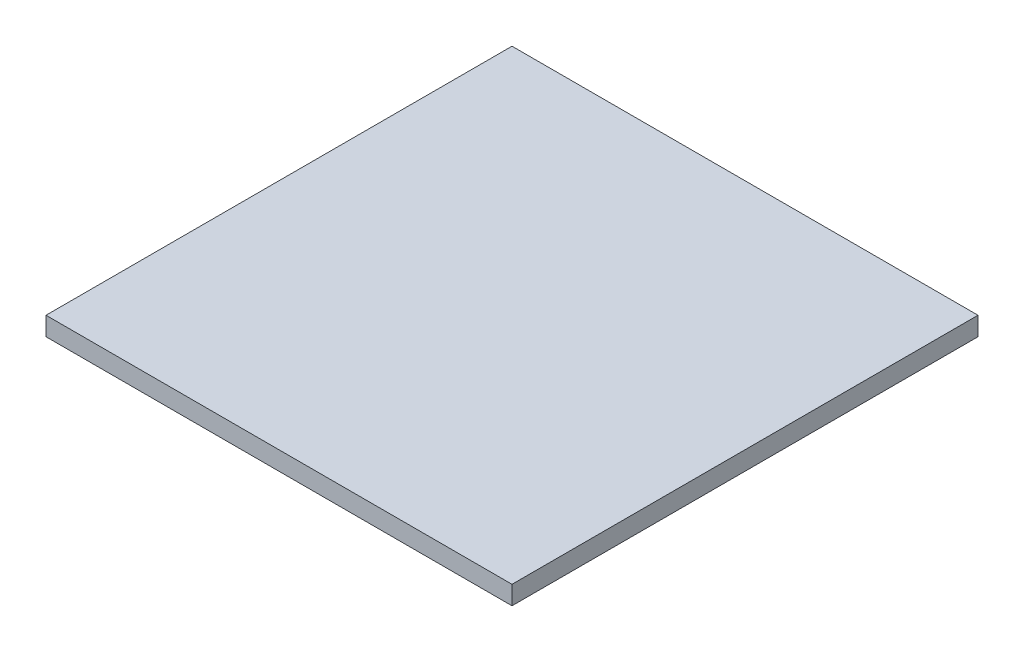
ISO-10303-21;
HEADER;
FILE_DESCRIPTION(('STEP AP214'),'2;1');
FILE_NAME('part.step','',(''),(''),'','','');
FILE_SCHEMA(('AUTOMOTIVE_DESIGN { 1 0 10303 214 1 1 1 1 }'));
ENDSEC;
DATA;
#1=APPLICATION_CONTEXT('core data for automotive mechanical design processes');
#2=APPLICATION_PROTOCOL_DEFINITION('international standard','automotive_design',2000,#1);
#3=PRODUCT_CONTEXT('',#1,'mechanical');
#4=PRODUCT('Part','Part','',(#3));
#5=PRODUCT_RELATED_PRODUCT_CATEGORY('part','',(#4));
#6=PRODUCT_DEFINITION_FORMATION('','',#4);
#7=PRODUCT_DEFINITION_CONTEXT('part definition',#1,'design');
#8=PRODUCT_DEFINITION('design','',#6,#7);
#9=PRODUCT_DEFINITION_SHAPE('','',#8);
#10=(LENGTH_UNIT() NAMED_UNIT(*) SI_UNIT(.MILLI.,.METRE.));
#11=(NAMED_UNIT(*) PLANE_ANGLE_UNIT() SI_UNIT($,.RADIAN.));
#12=(NAMED_UNIT(*) SI_UNIT($,.STERADIAN.) SOLID_ANGLE_UNIT());
#13=UNCERTAINTY_MEASURE_WITH_UNIT(LENGTH_MEASURE(1.E-05),#10,'distance_accuracy_value','');
#14=(GEOMETRIC_REPRESENTATION_CONTEXT(3) GLOBAL_UNCERTAINTY_ASSIGNED_CONTEXT((#13)) GLOBAL_UNIT_ASSIGNED_CONTEXT((#10,
#11,#12)) REPRESENTATION_CONTEXT('',''));
#15=CARTESIAN_POINT('',(0.,0.,0.));
#16=DIRECTION('',(0.,0.,1.));
#17=DIRECTION('',(1.,0.,0.));
#18=AXIS2_PLACEMENT_3D('',#15,#16,#17);
#19=CARTESIAN_POINT('',(0.,8.,0.));
#20=DIRECTION('',(-1.,0.,0.));
#21=DIRECTION('',(0.,0.,1.));
#22=AXIS2_PLACEMENT_3D('',#19,#20,#21);
#23=PLANE('',#22);
#24=DIRECTION('',(0.,0.,-1.));
#25=VECTOR('',#24,1.);
#26=CARTESIAN_POINT('',(0.,0.,0.));
#27=LINE('',#26,#25);
#28=CARTESIAN_POINT('',(0.,0.,0.));
#29=VERTEX_POINT('',#28);
#30=CARTESIAN_POINT('',(0.,0.,-200.));
#31=VERTEX_POINT('',#30);
#32=EDGE_CURVE('E98',#29,#31,#27,.T.);
#33=ORIENTED_EDGE('',*,*,#32,.T.);
#34=DIRECTION('',(0.,-1.,0.));
#35=VECTOR('',#34,1.);
#36=CARTESIAN_POINT('',(0.,8.,-200.));
#37=LINE('',#36,#35);
#38=CARTESIAN_POINT('',(0.,8.,-200.));
#39=VERTEX_POINT('',#38);
#40=EDGE_CURVE('E11',#39,#31,#37,.T.);
#41=ORIENTED_EDGE('',*,*,#40,.F.);
#42=DIRECTION('',(0.,0.,-1.));
#43=VECTOR('',#42,1.);
#44=CARTESIAN_POINT('',(0.,8.,0.));
#45=LINE('',#44,#43);
#46=CARTESIAN_POINT('',(0.,8.,0.));
#47=VERTEX_POINT('',#46);
#48=EDGE_CURVE('E86',#47,#39,#45,.T.);
#49=ORIENTED_EDGE('',*,*,#48,.F.);
#50=DIRECTION('',(0.,-1.,0.));
#51=VECTOR('',#50,1.);
#52=CARTESIAN_POINT('',(0.,8.,0.));
#53=LINE('',#52,#51);
#54=EDGE_CURVE('E94',#47,#29,#53,.T.);
#55=ORIENTED_EDGE('',*,*,#54,.T.);
#56=EDGE_LOOP('',(#33,#41,#49,#55));
#57=FACE_BOUND('',#56,.T.);
#58=ADVANCED_FACE('F35',(#57),#23,.F.);
#59=CARTESIAN_POINT('',(0.,8.,-200.));
#60=DIRECTION('',(0.,0.,1.));
#61=DIRECTION('',(1.,0.,0.));
#62=AXIS2_PLACEMENT_3D('',#59,#60,#61);
#63=PLANE('',#62);
#64=DIRECTION('',(-1.,0.,0.));
#65=VECTOR('',#64,1.);
#66=CARTESIAN_POINT('',(0.,0.,-200.));
#67=LINE('',#66,#65);
#68=CARTESIAN_POINT('',(-200.,0.,-200.));
#69=VERTEX_POINT('',#68);
#70=EDGE_CURVE('E90',#31,#69,#67,.T.);
#71=ORIENTED_EDGE('',*,*,#70,.T.);
#72=DIRECTION('',(0.,-1.,0.));
#73=VECTOR('',#72,1.);
#74=CARTESIAN_POINT('',(-200.,8.,-200.));
#75=LINE('',#74,#73);
#76=CARTESIAN_POINT('',(-200.,8.,-200.));
#77=VERTEX_POINT('',#76);
#78=EDGE_CURVE('E43',#77,#69,#75,.T.);
#79=ORIENTED_EDGE('',*,*,#78,.F.);
#80=DIRECTION('',(-1.,0.,0.));
#81=VECTOR('',#80,1.);
#82=CARTESIAN_POINT('',(0.,8.,-200.));
#83=LINE('',#82,#81);
#84=EDGE_CURVE('E81',#39,#77,#83,.T.);
#85=ORIENTED_EDGE('',*,*,#84,.F.);
#86=ORIENTED_EDGE('',*,*,#40,.T.);
#87=EDGE_LOOP('',(#71,#79,#85,#86));
#88=FACE_BOUND('',#87,.T.);
#89=ADVANCED_FACE('F89',(#88),#63,.F.);
#90=CARTESIAN_POINT('',(-200.,8.,0.));
#91=DIRECTION('',(1.,0.,0.));
#92=DIRECTION('',(0.,0.,-1.));
#93=AXIS2_PLACEMENT_3D('',#90,#91,#92);
#94=PLANE('',#93);
#95=DIRECTION('',(0.,0.,1.));
#96=VECTOR('',#95,1.);
#97=CARTESIAN_POINT('',(-200.,0.,0.));
#98=LINE('',#97,#96);
#99=CARTESIAN_POINT('',(-200.,0.,0.));
#100=VERTEX_POINT('',#99);
#101=EDGE_CURVE('E68',#69,#100,#98,.T.);
#102=ORIENTED_EDGE('',*,*,#101,.T.);
#103=DIRECTION('',(0.,-1.,0.));
#104=VECTOR('',#103,1.);
#105=CARTESIAN_POINT('',(-200.,8.,0.));
#106=LINE('',#105,#104);
#107=CARTESIAN_POINT('',(-200.,8.,0.));
#108=VERTEX_POINT('',#107);
#109=EDGE_CURVE('E91',#108,#100,#106,.T.);
#110=ORIENTED_EDGE('',*,*,#109,.F.);
#111=DIRECTION('',(0.,0.,1.));
#112=VECTOR('',#111,1.);
#113=CARTESIAN_POINT('',(-200.,8.,0.));
#114=LINE('',#113,#112);
#115=EDGE_CURVE('E84',#77,#108,#114,.T.);
#116=ORIENTED_EDGE('',*,*,#115,.F.);
#117=ORIENTED_EDGE('',*,*,#78,.T.);
#118=EDGE_LOOP('',(#102,#110,#116,#117));
#119=FACE_BOUND('',#118,.T.);
#120=ADVANCED_FACE('F92',(#119),#94,.F.);
#121=CARTESIAN_POINT('',(0.,8.,0.));
#122=DIRECTION('',(0.,0.,-1.));
#123=DIRECTION('',(-1.,0.,0.));
#124=AXIS2_PLACEMENT_3D('',#121,#122,#123);
#125=PLANE('',#124);
#126=DIRECTION('',(1.,0.,0.));
#127=VECTOR('',#126,1.);
#128=CARTESIAN_POINT('',(0.,0.,0.));
#129=LINE('',#128,#127);
#130=EDGE_CURVE('E74',#100,#29,#129,.T.);
#131=ORIENTED_EDGE('',*,*,#130,.T.);
#132=ORIENTED_EDGE('',*,*,#54,.F.);
#133=DIRECTION('',(1.,0.,0.));
#134=VECTOR('',#133,1.);
#135=CARTESIAN_POINT('',(0.,8.,0.));
#136=LINE('',#135,#134);
#137=EDGE_CURVE('E51',#108,#47,#136,.T.);
#138=ORIENTED_EDGE('',*,*,#137,.F.);
#139=ORIENTED_EDGE('',*,*,#109,.T.);
#140=EDGE_LOOP('',(#131,#132,#138,#139));
#141=FACE_BOUND('',#140,.T.);
#142=ADVANCED_FACE('F105',(#141),#125,.F.);
#143=CARTESIAN_POINT('',(0.,8.,0.));
#144=DIRECTION('',(0.,1.,0.));
#145=DIRECTION('',(0.,0.,1.));
#146=AXIS2_PLACEMENT_3D('',#143,#144,#145);
#147=PLANE('',#146);
#148=ORIENTED_EDGE('',*,*,#48,.T.);
#149=ORIENTED_EDGE('',*,*,#84,.T.);
#150=ORIENTED_EDGE('',*,*,#115,.T.);
#151=ORIENTED_EDGE('',*,*,#137,.T.);
#152=EDGE_LOOP('',(#148,#149,#150,#151));
#153=FACE_BOUND('',#152,.T.);
#154=ADVANCED_FACE('F82',(#153),#147,.T.);
#155=CARTESIAN_POINT('',(0.,0.,0.));
#156=DIRECTION('',(0.,1.,0.));
#157=DIRECTION('',(0.,0.,1.));
#158=AXIS2_PLACEMENT_3D('',#155,#156,#157);
#159=PLANE('',#158);
#160=ORIENTED_EDGE('',*,*,#32,.F.);
#161=ORIENTED_EDGE('',*,*,#130,.F.);
#162=ORIENTED_EDGE('',*,*,#101,.F.);
#163=ORIENTED_EDGE('',*,*,#70,.F.);
#164=EDGE_LOOP('',(#160,#161,#162,#163));
#165=FACE_BOUND('',#164,.T.);
#166=ADVANCED_FACE('F108',(#165),#159,.F.);
#167=CLOSED_SHELL('',(#58,#89,#120,#142,#154,#166));
#168=MANIFOLD_SOLID_BREP('B2',#167);
#169=ADVANCED_BREP_SHAPE_REPRESENTATION('',(#18,#168),#14);
#170=SHAPE_DEFINITION_REPRESENTATION(#9,#169);
ENDSEC;
END-ISO-10303-21;
